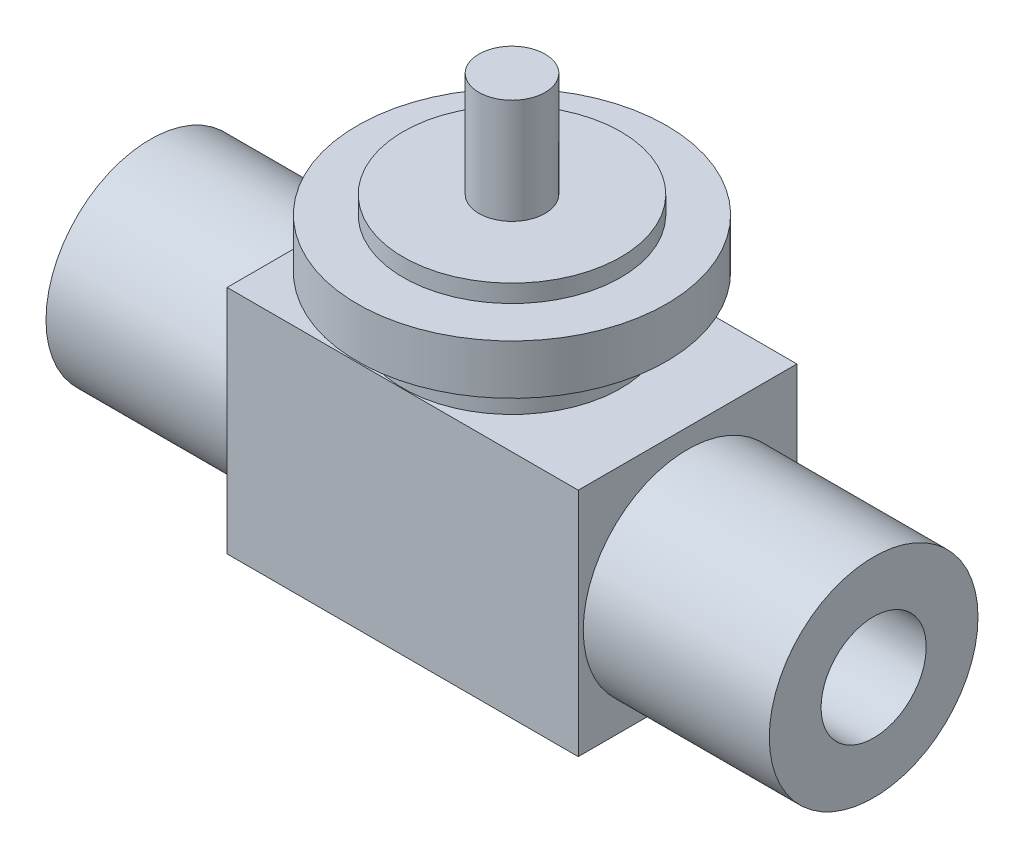
ISO-10303-21;
HEADER;
FILE_DESCRIPTION(('STEP AP214'),'2;1');
FILE_NAME('part.step','',(''),(''),'','','');
FILE_SCHEMA(('AUTOMOTIVE_DESIGN { 1 0 10303 214 1 1 1 1 }'));
ENDSEC;
DATA;
#1=APPLICATION_CONTEXT('core data for automotive mechanical design processes');
#2=APPLICATION_PROTOCOL_DEFINITION('international standard','automotive_design',2000,#1);
#3=PRODUCT_CONTEXT('',#1,'mechanical');
#4=PRODUCT('Part','Part','',(#3));
#5=PRODUCT_RELATED_PRODUCT_CATEGORY('part','',(#4));
#6=PRODUCT_DEFINITION_FORMATION('','',#4);
#7=PRODUCT_DEFINITION_CONTEXT('part definition',#1,'design');
#8=PRODUCT_DEFINITION('design','',#6,#7);
#9=PRODUCT_DEFINITION_SHAPE('','',#8);
#10=(LENGTH_UNIT() NAMED_UNIT(*) SI_UNIT(.MILLI.,.METRE.));
#11=(NAMED_UNIT(*) PLANE_ANGLE_UNIT() SI_UNIT($,.RADIAN.));
#12=(NAMED_UNIT(*) SI_UNIT($,.STERADIAN.) SOLID_ANGLE_UNIT());
#13=UNCERTAINTY_MEASURE_WITH_UNIT(LENGTH_MEASURE(1.E-05),#10,'distance_accuracy_value','');
#14=(GEOMETRIC_REPRESENTATION_CONTEXT(3) GLOBAL_UNCERTAINTY_ASSIGNED_CONTEXT((#13)) GLOBAL_UNIT_ASSIGNED_CONTEXT((#10,
#11,#12)) REPRESENTATION_CONTEXT('',''));
#15=CARTESIAN_POINT('',(0.,0.,0.));
#16=DIRECTION('',(0.,0.,1.));
#17=DIRECTION('',(1.,0.,0.));
#18=AXIS2_PLACEMENT_3D('',#15,#16,#17);
#19=CARTESIAN_POINT('',(-15.9,11.2,9.9));
#20=DIRECTION('',(1.,0.,0.));
#21=DIRECTION('',(0.,0.,-1.));
#22=AXIS2_PLACEMENT_3D('',#19,#20,#21);
#23=PLANE('',#22);
#24=CARTESIAN_POINT('',(-15.9,0.,0.));
#25=DIRECTION('',(-1.,0.,0.));
#26=DIRECTION('',(0.,0.,1.));
#27=AXIS2_PLACEMENT_3D('',#24,#25,#26);
#28=CIRCLE('',#27,9.45);
#29=CARTESIAN_POINT('',(-15.9,0.,9.45));
#30=VERTEX_POINT('',#29);
#31=EDGE_CURVE('E11',#30,#30,#28,.T.);
#32=ORIENTED_EDGE('',*,*,#31,.F.);
#33=EDGE_LOOP('',(#32));
#34=FACE_BOUND('',#33,.T.);
#35=DIRECTION('',(0.,-1.,0.));
#36=VECTOR('',#35,1.);
#37=CARTESIAN_POINT('',(-15.9,11.2,-9.9));
#38=LINE('',#37,#36);
#39=CARTESIAN_POINT('',(-15.9,11.2,-9.9));
#40=VERTEX_POINT('',#39);
#41=CARTESIAN_POINT('',(-15.9,-9.7,-9.9));
#42=VERTEX_POINT('',#41);
#43=EDGE_CURVE('E107',#40,#42,#38,.T.);
#44=ORIENTED_EDGE('',*,*,#43,.T.);
#45=DIRECTION('',(0.,0.,-1.));
#46=VECTOR('',#45,1.);
#47=CARTESIAN_POINT('',(-15.9,-9.7,9.9));
#48=LINE('',#47,#46);
#49=CARTESIAN_POINT('',(-15.9,-9.7,9.9));
#50=VERTEX_POINT('',#49);
#51=EDGE_CURVE('E49',#50,#42,#48,.T.);
#52=ORIENTED_EDGE('',*,*,#51,.F.);
#53=DIRECTION('',(0.,-1.,0.));
#54=VECTOR('',#53,1.);
#55=CARTESIAN_POINT('',(-15.9,11.2,9.9));
#56=LINE('',#55,#54);
#57=CARTESIAN_POINT('',(-15.9,11.2,9.9));
#58=VERTEX_POINT('',#57);
#59=EDGE_CURVE('E93',#58,#50,#56,.T.);
#60=ORIENTED_EDGE('',*,*,#59,.F.);
#61=DIRECTION('',(0.,0.,-1.));
#62=VECTOR('',#61,1.);
#63=CARTESIAN_POINT('',(-15.9,11.2,9.9));
#64=LINE('',#63,#62);
#65=EDGE_CURVE('E102',#58,#40,#64,.T.);
#66=ORIENTED_EDGE('',*,*,#65,.T.);
#67=EDGE_LOOP('',(#44,#52,#60,#66));
#68=FACE_BOUND('',#67,.T.);
#69=ADVANCED_FACE('F41',(#34,#68),#23,.F.);
#70=CARTESIAN_POINT('',(-15.9,-9.7,9.9));
#71=DIRECTION('',(0.,1.,0.));
#72=DIRECTION('',(0.,0.,1.));
#73=AXIS2_PLACEMENT_3D('',#70,#71,#72);
#74=PLANE('',#73);
#75=DIRECTION('',(1.,0.,0.));
#76=VECTOR('',#75,1.);
#77=CARTESIAN_POINT('',(-15.9,-9.7,-9.9));
#78=LINE('',#77,#76);
#79=CARTESIAN_POINT('',(15.9,-9.7,-9.9));
#80=VERTEX_POINT('',#79);
#81=EDGE_CURVE('E99',#42,#80,#78,.T.);
#82=ORIENTED_EDGE('',*,*,#81,.T.);
#83=DIRECTION('',(0.,0.,-1.));
#84=VECTOR('',#83,1.);
#85=CARTESIAN_POINT('',(15.9,-9.7,9.9));
#86=LINE('',#85,#84);
#87=CARTESIAN_POINT('',(15.9,-9.7,9.9));
#88=VERTEX_POINT('',#87);
#89=EDGE_CURVE('E96',#88,#80,#86,.T.);
#90=ORIENTED_EDGE('',*,*,#89,.F.);
#91=DIRECTION('',(1.,0.,0.));
#92=VECTOR('',#91,1.);
#93=CARTESIAN_POINT('',(-15.9,-9.7,9.9));
#94=LINE('',#93,#92);
#95=EDGE_CURVE('E90',#50,#88,#94,.T.);
#96=ORIENTED_EDGE('',*,*,#95,.F.);
#97=ORIENTED_EDGE('',*,*,#51,.T.);
#98=EDGE_LOOP('',(#82,#90,#96,#97));
#99=FACE_BOUND('',#98,.T.);
#100=ADVANCED_FACE('F100',(#99),#74,.F.);
#101=CARTESIAN_POINT('',(15.9,-9.7,9.9));
#102=DIRECTION('',(-1.,0.,0.));
#103=DIRECTION('',(0.,0.,1.));
#104=AXIS2_PLACEMENT_3D('',#101,#102,#103);
#105=PLANE('',#104);
#106=CARTESIAN_POINT('',(15.9,0.,0.));
#107=DIRECTION('',(-1.,0.,0.));
#108=DIRECTION('',(0.,0.,1.));
#109=AXIS2_PLACEMENT_3D('',#106,#107,#108);
#110=CIRCLE('',#109,9.45);
#111=CARTESIAN_POINT('',(15.9,0.,9.45));
#112=VERTEX_POINT('',#111);
#113=EDGE_CURVE('E123',#112,#112,#110,.T.);
#114=ORIENTED_EDGE('',*,*,#113,.T.);
#115=EDGE_LOOP('',(#114));
#116=FACE_BOUND('',#115,.T.);
#117=DIRECTION('',(0.,1.,0.));
#118=VECTOR('',#117,1.);
#119=CARTESIAN_POINT('',(15.9,-9.7,-9.9));
#120=LINE('',#119,#118);
#121=CARTESIAN_POINT('',(15.9,11.2,-9.9));
#122=VERTEX_POINT('',#121);
#123=EDGE_CURVE('E77',#80,#122,#120,.T.);
#124=ORIENTED_EDGE('',*,*,#123,.T.);
#125=DIRECTION('',(0.,0.,-1.));
#126=VECTOR('',#125,1.);
#127=CARTESIAN_POINT('',(15.9,11.2,9.9));
#128=LINE('',#127,#126);
#129=CARTESIAN_POINT('',(15.9,11.2,9.9));
#130=VERTEX_POINT('',#129);
#131=EDGE_CURVE('E103',#130,#122,#128,.T.);
#132=ORIENTED_EDGE('',*,*,#131,.F.);
#133=DIRECTION('',(0.,1.,0.));
#134=VECTOR('',#133,1.);
#135=CARTESIAN_POINT('',(15.9,-9.7,9.9));
#136=LINE('',#135,#134);
#137=EDGE_CURVE('E94',#88,#130,#136,.T.);
#138=ORIENTED_EDGE('',*,*,#137,.F.);
#139=ORIENTED_EDGE('',*,*,#89,.T.);
#140=EDGE_LOOP('',(#124,#132,#138,#139));
#141=FACE_BOUND('',#140,.T.);
#142=ADVANCED_FACE('F101',(#116,#141),#105,.F.);
#143=CARTESIAN_POINT('',(15.9,11.2,9.9));
#144=DIRECTION('',(0.,-1.,0.));
#145=DIRECTION('',(0.,0.,-1.));
#146=AXIS2_PLACEMENT_3D('',#143,#144,#145);
#147=PLANE('',#146);
#148=CARTESIAN_POINT('',(0.,11.2,0.));
#149=DIRECTION('',(0.,-1.,0.));
#150=DIRECTION('',(0.,0.,-1.));
#151=AXIS2_PLACEMENT_3D('',#148,#149,#150);
#152=CIRCLE('',#151,9.85);
#153=CARTESIAN_POINT('',(0.,11.2,-9.85));
#154=VERTEX_POINT('',#153);
#155=EDGE_CURVE('E185',#154,#154,#152,.T.);
#156=ORIENTED_EDGE('',*,*,#155,.T.);
#157=EDGE_LOOP('',(#156));
#158=FACE_BOUND('',#157,.T.);
#159=DIRECTION('',(-1.,0.,0.));
#160=VECTOR('',#159,1.);
#161=CARTESIAN_POINT('',(15.9,11.2,-9.9));
#162=LINE('',#161,#160);
#163=EDGE_CURVE('E85',#122,#40,#162,.T.);
#164=ORIENTED_EDGE('',*,*,#163,.T.);
#165=ORIENTED_EDGE('',*,*,#65,.F.);
#166=DIRECTION('',(-1.,0.,0.));
#167=VECTOR('',#166,1.);
#168=CARTESIAN_POINT('',(15.9,11.2,9.9));
#169=LINE('',#168,#167);
#170=EDGE_CURVE('E56',#130,#58,#169,.T.);
#171=ORIENTED_EDGE('',*,*,#170,.F.);
#172=ORIENTED_EDGE('',*,*,#131,.T.);
#173=EDGE_LOOP('',(#164,#165,#171,#172));
#174=FACE_BOUND('',#173,.T.);
#175=ADVANCED_FACE('F166',(#158,#174),#147,.F.);
#176=CARTESIAN_POINT('',(0.,0.,9.9));
#177=DIRECTION('',(0.,0.,1.));
#178=DIRECTION('',(1.,0.,0.));
#179=AXIS2_PLACEMENT_3D('',#176,#177,#178);
#180=PLANE('',#179);
#181=ORIENTED_EDGE('',*,*,#59,.T.);
#182=ORIENTED_EDGE('',*,*,#95,.T.);
#183=ORIENTED_EDGE('',*,*,#137,.T.);
#184=ORIENTED_EDGE('',*,*,#170,.T.);
#185=EDGE_LOOP('',(#181,#182,#183,#184));
#186=FACE_BOUND('',#185,.T.);
#187=ADVANCED_FACE('F92',(#186),#180,.T.);
#188=CARTESIAN_POINT('',(0.,0.,-9.9));
#189=DIRECTION('',(0.,0.,1.));
#190=DIRECTION('',(1.,0.,0.));
#191=AXIS2_PLACEMENT_3D('',#188,#189,#190);
#192=PLANE('',#191);
#193=ORIENTED_EDGE('',*,*,#43,.F.);
#194=ORIENTED_EDGE('',*,*,#163,.F.);
#195=ORIENTED_EDGE('',*,*,#123,.F.);
#196=ORIENTED_EDGE('',*,*,#81,.F.);
#197=EDGE_LOOP('',(#193,#194,#195,#196));
#198=FACE_BOUND('',#197,.T.);
#199=ADVANCED_FACE('F143',(#198),#192,.F.);
#200=CARTESIAN_POINT('',(32.75,0.,0.));
#201=DIRECTION('',(-1.,0.,0.));
#202=DIRECTION('',(0.,0.,1.));
#203=AXIS2_PLACEMENT_3D('',#200,#201,#202);
#204=PLANE('',#203);
#205=CARTESIAN_POINT('',(32.7500000000001,0.,0.));
#206=DIRECTION('',(-1.,0.,0.));
#207=DIRECTION('',(0.,0.,1.));
#208=AXIS2_PLACEMENT_3D('',#205,#206,#207);
#209=CIRCLE('',#208,4.7625);
#210=CARTESIAN_POINT('',(32.7500000000001,0.,4.7625));
#211=VERTEX_POINT('',#210);
#212=EDGE_CURVE('E117',#211,#211,#209,.F.);
#213=ORIENTED_EDGE('',*,*,#212,.F.);
#214=EDGE_LOOP('',(#213));
#215=FACE_BOUND('',#214,.T.);
#216=CARTESIAN_POINT('',(32.7500000000001,0.,0.));
#217=DIRECTION('',(-1.,0.,0.));
#218=DIRECTION('',(0.,0.,1.));
#219=AXIS2_PLACEMENT_3D('',#216,#217,#218);
#220=CIRCLE('',#219,9.45);
#221=CARTESIAN_POINT('',(32.7500000000001,0.,9.45));
#222=VERTEX_POINT('',#221);
#223=EDGE_CURVE('E115',#222,#222,#220,.T.);
#224=ORIENTED_EDGE('',*,*,#223,.F.);
#225=EDGE_LOOP('',(#224));
#226=FACE_BOUND('',#225,.T.);
#227=ADVANCED_FACE('F141',(#215,#226),#204,.F.);
#228=CARTESIAN_POINT('',(-1000.,0.,0.));
#229=DIRECTION('',(-1.,0.,0.));
#230=DIRECTION('',(0.,0.,1.));
#231=AXIS2_PLACEMENT_3D('',#228,#229,#230);
#232=CYLINDRICAL_SURFACE('',#231,9.45);
#233=ORIENTED_EDGE('',*,*,#113,.F.);
#234=EDGE_LOOP('',(#233));
#235=FACE_BOUND('',#234,.T.);
#236=ORIENTED_EDGE('',*,*,#223,.T.);
#237=EDGE_LOOP('',(#236));
#238=FACE_BOUND('',#237,.T.);
#239=ADVANCED_FACE('F142',(#235,#238),#232,.T.);
#240=CARTESIAN_POINT('',(-32.75,9.45,0.));
#241=DIRECTION('',(1.,0.,0.));
#242=DIRECTION('',(0.,0.,-1.));
#243=AXIS2_PLACEMENT_3D('',#240,#241,#242);
#244=PLANE('',#243);
#245=CARTESIAN_POINT('',(-32.7500000000001,0.,0.));
#246=DIRECTION('',(1.,0.,0.));
#247=DIRECTION('',(0.,0.,-1.));
#248=AXIS2_PLACEMENT_3D('',#245,#246,#247);
#249=CIRCLE('',#248,4.7625);
#250=CARTESIAN_POINT('',(-32.7500000000001,0.,-4.7625));
#251=VERTEX_POINT('',#250);
#252=EDGE_CURVE('E42',#251,#251,#249,.F.);
#253=ORIENTED_EDGE('',*,*,#252,.F.);
#254=EDGE_LOOP('',(#253));
#255=FACE_BOUND('',#254,.T.);
#256=CARTESIAN_POINT('',(-32.7500000000001,0.,0.));
#257=DIRECTION('',(-1.,0.,0.));
#258=DIRECTION('',(0.,0.,1.));
#259=AXIS2_PLACEMENT_3D('',#256,#257,#258);
#260=CIRCLE('',#259,9.45);
#261=CARTESIAN_POINT('',(-32.7500000000001,0.,9.45));
#262=VERTEX_POINT('',#261);
#263=EDGE_CURVE('E119',#262,#262,#260,.T.);
#264=ORIENTED_EDGE('',*,*,#263,.T.);
#265=EDGE_LOOP('',(#264));
#266=FACE_BOUND('',#265,.T.);
#267=ADVANCED_FACE('F154',(#255,#266),#244,.F.);
#268=CARTESIAN_POINT('',(-1000.,0.,0.));
#269=DIRECTION('',(-1.,0.,0.));
#270=DIRECTION('',(0.,0.,1.));
#271=AXIS2_PLACEMENT_3D('',#268,#269,#270);
#272=CYLINDRICAL_SURFACE('',#271,9.45);
#273=ORIENTED_EDGE('',*,*,#263,.F.);
#274=EDGE_LOOP('',(#273));
#275=FACE_BOUND('',#274,.T.);
#276=ORIENTED_EDGE('',*,*,#31,.T.);
#277=EDGE_LOOP('',(#276));
#278=FACE_BOUND('',#277,.T.);
#279=ADVANCED_FACE('F255',(#275,#278),#272,.T.);
#280=CARTESIAN_POINT('',(-1000.,0.,0.));
#281=DIRECTION('',(-1.,0.,0.));
#282=DIRECTION('',(0.,0.,1.));
#283=AXIS2_PLACEMENT_3D('',#280,#281,#282);
#284=CYLINDRICAL_SURFACE('',#283,4.7625);
#285=CARTESIAN_POINT('',(15.9499999999999,0.,0.));
#286=DIRECTION('',(-1.,0.,0.));
#287=DIRECTION('',(0.,0.,1.));
#288=AXIS2_PLACEMENT_3D('',#285,#286,#287);
#289=CIRCLE('',#288,4.7625);
#290=CARTESIAN_POINT('',(15.9499999999999,0.,4.7625));
#291=VERTEX_POINT('',#290);
#292=EDGE_CURVE('E122',#291,#291,#289,.T.);
#293=ORIENTED_EDGE('',*,*,#292,.T.);
#294=EDGE_LOOP('',(#293));
#295=FACE_BOUND('',#294,.T.);
#296=ORIENTED_EDGE('',*,*,#212,.T.);
#297=EDGE_LOOP('',(#296));
#298=FACE_BOUND('',#297,.T.);
#299=ADVANCED_FACE('F249',(#295,#298),#284,.F.);
#300=CARTESIAN_POINT('',(15.95,4.7625,0.));
#301=DIRECTION('',(1.,0.,0.));
#302=DIRECTION('',(0.,0.,-1.));
#303=AXIS2_PLACEMENT_3D('',#300,#301,#302);
#304=PLANE('',#303);
#305=ORIENTED_EDGE('',*,*,#292,.F.);
#306=EDGE_LOOP('',(#305));
#307=FACE_BOUND('',#306,.T.);
#308=ADVANCED_FACE('F246',(#307),#304,.T.);
#309=CARTESIAN_POINT('',(-1000.,0.,0.));
#310=DIRECTION('',(-1.,0.,0.));
#311=DIRECTION('',(0.,0.,1.));
#312=AXIS2_PLACEMENT_3D('',#309,#310,#311);
#313=CYLINDRICAL_SURFACE('',#312,4.7625);
#314=CARTESIAN_POINT('',(-15.95,0.,0.));
#315=DIRECTION('',(-1.,0.,0.));
#316=DIRECTION('',(0.,0.,1.));
#317=AXIS2_PLACEMENT_3D('',#314,#315,#316);
#318=CIRCLE('',#317,4.7625);
#319=CARTESIAN_POINT('',(-15.95,0.,4.7625));
#320=VERTEX_POINT('',#319);
#321=EDGE_CURVE('E132',#320,#320,#318,.T.);
#322=ORIENTED_EDGE('',*,*,#321,.F.);
#323=EDGE_LOOP('',(#322));
#324=FACE_BOUND('',#323,.T.);
#325=ORIENTED_EDGE('',*,*,#252,.T.);
#326=EDGE_LOOP('',(#325));
#327=FACE_BOUND('',#326,.T.);
#328=ADVANCED_FACE('F243',(#324,#327),#313,.F.);
#329=CARTESIAN_POINT('',(-15.95,0.,0.));
#330=DIRECTION('',(-1.,0.,0.));
#331=DIRECTION('',(0.,0.,1.));
#332=AXIS2_PLACEMENT_3D('',#329,#330,#331);
#333=PLANE('',#332);
#334=ORIENTED_EDGE('',*,*,#321,.T.);
#335=EDGE_LOOP('',(#334));
#336=FACE_BOUND('',#335,.T.);
#337=ADVANCED_FACE('F241',(#336),#333,.T.);
#338=CARTESIAN_POINT('',(0.,-500.,0.));
#339=DIRECTION('',(0.,-1.,0.));
#340=DIRECTION('',(0.,0.,-1.));
#341=AXIS2_PLACEMENT_3D('',#338,#339,#340);
#342=CYLINDRICAL_SURFACE('',#341,9.85);
#343=CARTESIAN_POINT('',(0.,15.4,0.));
#344=DIRECTION('',(0.,-1.,0.));
#345=DIRECTION('',(0.,0.,-1.));
#346=AXIS2_PLACEMENT_3D('',#343,#344,#345);
#347=CIRCLE('',#346,9.85);
#348=CARTESIAN_POINT('',(0.,15.4,-9.85));
#349=VERTEX_POINT('',#348);
#350=EDGE_CURVE('E183',#349,#349,#347,.T.);
#351=ORIENTED_EDGE('',*,*,#350,.T.);
#352=EDGE_LOOP('',(#351));
#353=FACE_BOUND('',#352,.T.);
#354=ORIENTED_EDGE('',*,*,#155,.F.);
#355=EDGE_LOOP('',(#354));
#356=FACE_BOUND('',#355,.T.);
#357=ADVANCED_FACE('F238',(#353,#356),#342,.T.);
#358=CARTESIAN_POINT('',(9.85,15.4,0.));
#359=DIRECTION('',(0.,-1.,0.));
#360=DIRECTION('',(0.,0.,-1.));
#361=AXIS2_PLACEMENT_3D('',#358,#359,#360);
#362=PLANE('',#361);
#363=CARTESIAN_POINT('',(0.,15.4,0.));
#364=DIRECTION('',(0.,-1.,0.));
#365=DIRECTION('',(0.,0.,-1.));
#366=AXIS2_PLACEMENT_3D('',#363,#364,#365);
#367=CIRCLE('',#366,14.);
#368=CARTESIAN_POINT('',(0.,15.4,-14.));
#369=VERTEX_POINT('',#368);
#370=EDGE_CURVE('E190',#369,#369,#367,.T.);
#371=ORIENTED_EDGE('',*,*,#370,.T.);
#372=EDGE_LOOP('',(#371));
#373=FACE_BOUND('',#372,.T.);
#374=ORIENTED_EDGE('',*,*,#350,.F.);
#375=EDGE_LOOP('',(#374));
#376=FACE_BOUND('',#375,.T.);
#377=ADVANCED_FACE('F234',(#373,#376),#362,.T.);
#378=CARTESIAN_POINT('',(0.,-500.,0.));
#379=DIRECTION('',(0.,-1.,0.));
#380=DIRECTION('',(0.,0.,-1.));
#381=AXIS2_PLACEMENT_3D('',#378,#379,#380);
#382=CYLINDRICAL_SURFACE('',#381,14.);
#383=CARTESIAN_POINT('',(0.,19.9,0.));
#384=DIRECTION('',(0.,-1.,0.));
#385=DIRECTION('',(0.,0.,-1.));
#386=AXIS2_PLACEMENT_3D('',#383,#384,#385);
#387=CIRCLE('',#386,14.);
#388=CARTESIAN_POINT('',(0.,19.9,-14.));
#389=VERTEX_POINT('',#388);
#390=EDGE_CURVE('E195',#389,#389,#387,.T.);
#391=ORIENTED_EDGE('',*,*,#390,.T.);
#392=EDGE_LOOP('',(#391));
#393=FACE_BOUND('',#392,.T.);
#394=ORIENTED_EDGE('',*,*,#370,.F.);
#395=EDGE_LOOP('',(#394));
#396=FACE_BOUND('',#395,.T.);
#397=ADVANCED_FACE('F229',(#393,#396),#382,.T.);
#398=CARTESIAN_POINT('',(14.,19.9,0.));
#399=DIRECTION('',(0.,1.,0.));
#400=DIRECTION('',(0.,0.,1.));
#401=AXIS2_PLACEMENT_3D('',#398,#399,#400);
#402=PLANE('',#401);
#403=CARTESIAN_POINT('',(0.,19.9,0.));
#404=DIRECTION('',(0.,-1.,0.));
#405=DIRECTION('',(0.,0.,-1.));
#406=AXIS2_PLACEMENT_3D('',#403,#404,#405);
#407=CIRCLE('',#406,9.85);
#408=CARTESIAN_POINT('',(0.,19.9,-9.85));
#409=VERTEX_POINT('',#408);
#410=EDGE_CURVE('E193',#409,#409,#407,.T.);
#411=ORIENTED_EDGE('',*,*,#410,.T.);
#412=EDGE_LOOP('',(#411));
#413=FACE_BOUND('',#412,.T.);
#414=ORIENTED_EDGE('',*,*,#390,.F.);
#415=EDGE_LOOP('',(#414));
#416=FACE_BOUND('',#415,.T.);
#417=ADVANCED_FACE('F228',(#413,#416),#402,.T.);
#418=CARTESIAN_POINT('',(0.,-500.,0.));
#419=DIRECTION('',(0.,-1.,0.));
#420=DIRECTION('',(0.,0.,-1.));
#421=AXIS2_PLACEMENT_3D('',#418,#419,#420);
#422=CYLINDRICAL_SURFACE('',#421,9.85);
#423=CARTESIAN_POINT('',(0.,21.5,0.));
#424=DIRECTION('',(0.,-1.,0.));
#425=DIRECTION('',(0.,0.,-1.));
#426=AXIS2_PLACEMENT_3D('',#423,#424,#425);
#427=CIRCLE('',#426,9.85);
#428=CARTESIAN_POINT('',(0.,21.5,-9.85));
#429=VERTEX_POINT('',#428);
#430=EDGE_CURVE('E199',#429,#429,#427,.T.);
#431=ORIENTED_EDGE('',*,*,#430,.T.);
#432=EDGE_LOOP('',(#431));
#433=FACE_BOUND('',#432,.T.);
#434=ORIENTED_EDGE('',*,*,#410,.F.);
#435=EDGE_LOOP('',(#434));
#436=FACE_BOUND('',#435,.T.);
#437=ADVANCED_FACE('F225',(#433,#436),#422,.T.);
#438=CARTESIAN_POINT('',(9.85,21.5,0.));
#439=DIRECTION('',(0.,1.,0.));
#440=DIRECTION('',(0.,0.,1.));
#441=AXIS2_PLACEMENT_3D('',#438,#439,#440);
#442=PLANE('',#441);
#443=CARTESIAN_POINT('',(0.,21.5,0.));
#444=DIRECTION('',(0.,-1.,0.));
#445=DIRECTION('',(0.,0.,-1.));
#446=AXIS2_PLACEMENT_3D('',#443,#444,#445);
#447=CIRCLE('',#446,3.);
#448=CARTESIAN_POINT('',(0.,21.5,-3.));
#449=VERTEX_POINT('',#448);
#450=EDGE_CURVE('E202',#449,#449,#447,.T.);
#451=ORIENTED_EDGE('',*,*,#450,.T.);
#452=EDGE_LOOP('',(#451));
#453=FACE_BOUND('',#452,.T.);
#454=ORIENTED_EDGE('',*,*,#430,.F.);
#455=EDGE_LOOP('',(#454));
#456=FACE_BOUND('',#455,.T.);
#457=ADVANCED_FACE('F217',(#453,#456),#442,.T.);
#458=CARTESIAN_POINT('',(0.,-500.,0.));
#459=DIRECTION('',(0.,-1.,0.));
#460=DIRECTION('',(0.,0.,-1.));
#461=AXIS2_PLACEMENT_3D('',#458,#459,#460);
#462=CYLINDRICAL_SURFACE('',#461,3.);
#463=CARTESIAN_POINT('',(0.,31.,0.));
#464=DIRECTION('',(0.,-1.,0.));
#465=DIRECTION('',(0.,0.,-1.));
#466=AXIS2_PLACEMENT_3D('',#463,#464,#465);
#467=CIRCLE('',#466,3.);
#468=CARTESIAN_POINT('',(0.,31.,-3.));
#469=VERTEX_POINT('',#468);
#470=EDGE_CURVE('E201',#469,#469,#467,.T.);
#471=ORIENTED_EDGE('',*,*,#470,.T.);
#472=EDGE_LOOP('',(#471));
#473=FACE_BOUND('',#472,.T.);
#474=ORIENTED_EDGE('',*,*,#450,.F.);
#475=EDGE_LOOP('',(#474));
#476=FACE_BOUND('',#475,.T.);
#477=ADVANCED_FACE('F206',(#473,#476),#462,.T.);
#478=CARTESIAN_POINT('',(3.,31.,0.));
#479=DIRECTION('',(0.,1.,0.));
#480=DIRECTION('',(0.,0.,1.));
#481=AXIS2_PLACEMENT_3D('',#478,#479,#480);
#482=PLANE('',#481);
#483=ORIENTED_EDGE('',*,*,#470,.F.);
#484=EDGE_LOOP('',(#483));
#485=FACE_BOUND('',#484,.T.);
#486=ADVANCED_FACE('F212',(#485),#482,.T.);
#487=CLOSED_SHELL('',(#69,#100,#142,#175,#187,#199,#227,#239,#267,#279,#299,#308,#328,#337,#357,
#377,#397,#417,#437,#457,#477,#486));
#488=MANIFOLD_SOLID_BREP('B2',#487);
#489=ADVANCED_BREP_SHAPE_REPRESENTATION('',(#18,#488),#14);
#490=SHAPE_DEFINITION_REPRESENTATION(#9,#489);
ENDSEC;
END-ISO-10303-21;
